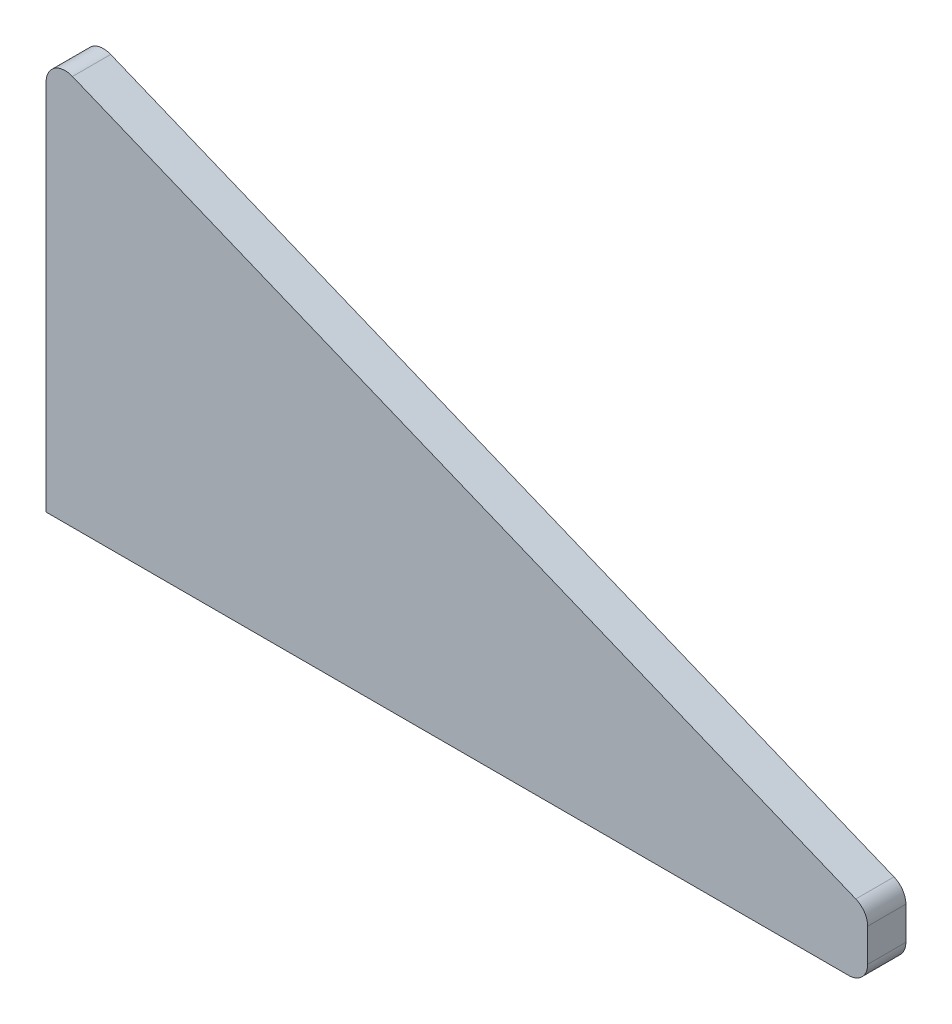
ISO-10303-21;
HEADER;
FILE_DESCRIPTION(('STEP AP214'),'2;1');
FILE_NAME('part.step','',(''),(''),'','','');
FILE_SCHEMA(('AUTOMOTIVE_DESIGN { 1 0 10303 214 1 1 1 1 }'));
ENDSEC;
DATA;
#1=APPLICATION_CONTEXT('core data for automotive mechanical design processes');
#2=APPLICATION_PROTOCOL_DEFINITION('international standard','automotive_design',2000,#1);
#3=PRODUCT_CONTEXT('',#1,'mechanical');
#4=PRODUCT('Part','Part','',(#3));
#5=PRODUCT_RELATED_PRODUCT_CATEGORY('part','',(#4));
#6=PRODUCT_DEFINITION_FORMATION('','',#4);
#7=PRODUCT_DEFINITION_CONTEXT('part definition',#1,'design');
#8=PRODUCT_DEFINITION('design','',#6,#7);
#9=PRODUCT_DEFINITION_SHAPE('','',#8);
#10=(LENGTH_UNIT() NAMED_UNIT(*) SI_UNIT(.MILLI.,.METRE.));
#11=(NAMED_UNIT(*) PLANE_ANGLE_UNIT() SI_UNIT($,.RADIAN.));
#12=(NAMED_UNIT(*) SI_UNIT($,.STERADIAN.) SOLID_ANGLE_UNIT());
#13=UNCERTAINTY_MEASURE_WITH_UNIT(LENGTH_MEASURE(1.E-05),#10,'distance_accuracy_value','');
#14=(GEOMETRIC_REPRESENTATION_CONTEXT(3) GLOBAL_UNCERTAINTY_ASSIGNED_CONTEXT((#13)) GLOBAL_UNIT_ASSIGNED_CONTEXT((#10,
#11,#12)) REPRESENTATION_CONTEXT('',''));
#15=CARTESIAN_POINT('',(0.,0.,0.));
#16=DIRECTION('',(0.,0.,1.));
#17=DIRECTION('',(1.,0.,0.));
#18=AXIS2_PLACEMENT_3D('',#15,#16,#17);
#19=CARTESIAN_POINT('',(-85.5050231709595,-49.7933467110658,10.));
#20=DIRECTION('',(0.,1.,0.));
#21=DIRECTION('',(0.,0.,1.));
#22=AXIS2_PLACEMENT_3D('',#19,#20,#21);
#23=PLANE('',#22);
#24=DIRECTION('',(1.,0.,0.));
#25=VECTOR('',#24,1.);
#26=CARTESIAN_POINT('',(-85.5050231709595,-49.7933467110658,0.));
#27=LINE('',#26,#25);
#28=CARTESIAN_POINT('',(-85.5050231709595,-49.7933467110658,0.));
#29=VERTEX_POINT('',#28);
#30=CARTESIAN_POINT('',(124.49497682904,-49.7933467110658,0.));
#31=VERTEX_POINT('',#30);
#32=EDGE_CURVE('E134',#29,#31,#27,.T.);
#33=ORIENTED_EDGE('',*,*,#32,.T.);
#34=DIRECTION('',(0.,0.,-1.));
#35=VECTOR('',#34,1.);
#36=CARTESIAN_POINT('',(124.49497682904,-49.7933467110658,10.));
#37=LINE('',#36,#35);
#38=CARTESIAN_POINT('',(124.49497682904,-49.7933467110658,10.));
#39=VERTEX_POINT('',#38);
#40=EDGE_CURVE('E11',#39,#31,#37,.T.);
#41=ORIENTED_EDGE('',*,*,#40,.F.);
#42=DIRECTION('',(1.,0.,0.));
#43=VECTOR('',#42,1.);
#44=CARTESIAN_POINT('',(-85.5050231709595,-49.7933467110658,10.));
#45=LINE('',#44,#43);
#46=CARTESIAN_POINT('',(-85.5050231709595,-49.7933467110658,10.));
#47=VERTEX_POINT('',#46);
#48=EDGE_CURVE('E153',#47,#39,#45,.T.);
#49=ORIENTED_EDGE('',*,*,#48,.F.);
#50=DIRECTION('',(0.,0.,-1.));
#51=VECTOR('',#50,1.);
#52=CARTESIAN_POINT('',(-85.5050231709595,-49.7933467110658,10.));
#53=LINE('',#52,#51);
#54=EDGE_CURVE('E130',#47,#29,#53,.T.);
#55=ORIENTED_EDGE('',*,*,#54,.T.);
#56=EDGE_LOOP('',(#33,#41,#49,#55));
#57=FACE_BOUND('',#56,.T.);
#58=ADVANCED_FACE('F39',(#57),#23,.F.);
#59=CARTESIAN_POINT('',(124.49497682904,-44.7933467110658,10.));
#60=DIRECTION('',(0.,0.,-1.));
#61=DIRECTION('',(-1.,0.,0.));
#62=AXIS2_PLACEMENT_3D('',#59,#60,#61);
#63=CYLINDRICAL_SURFACE('',#62,5.);
#64=CARTESIAN_POINT('',(124.49497682904,-44.7933467110658,0.));
#65=DIRECTION('',(0.,0.,1.));
#66=DIRECTION('',(-1.,0.,0.));
#67=AXIS2_PLACEMENT_3D('',#64,#65,#66);
#68=CIRCLE('',#67,5.);
#69=CARTESIAN_POINT('',(129.49497682904,-44.7933467110658,0.));
#70=VERTEX_POINT('',#69);
#71=EDGE_CURVE('E138',#31,#70,#68,.T.);
#72=ORIENTED_EDGE('',*,*,#71,.T.);
#73=DIRECTION('',(0.,0.,-1.));
#74=VECTOR('',#73,1.);
#75=CARTESIAN_POINT('',(129.49497682904,-44.7933467110658,10.));
#76=LINE('',#75,#74);
#77=CARTESIAN_POINT('',(129.49497682904,-44.7933467110658,10.));
#78=VERTEX_POINT('',#77);
#79=EDGE_CURVE('E48',#78,#70,#76,.T.);
#80=ORIENTED_EDGE('',*,*,#79,.F.);
#81=CARTESIAN_POINT('',(124.49497682904,-44.7933467110658,10.));
#82=DIRECTION('',(0.,0.,1.));
#83=DIRECTION('',(-1.,0.,0.));
#84=AXIS2_PLACEMENT_3D('',#81,#82,#83);
#85=CIRCLE('',#84,5.);
#86=EDGE_CURVE('E96',#39,#78,#85,.T.);
#87=ORIENTED_EDGE('',*,*,#86,.F.);
#88=ORIENTED_EDGE('',*,*,#40,.T.);
#89=EDGE_LOOP('',(#72,#80,#87,#88));
#90=FACE_BOUND('',#89,.T.);
#91=ADVANCED_FACE('F187',(#90),#63,.T.);
#92=CARTESIAN_POINT('',(129.49497682904,-36.149446474251,10.));
#93=DIRECTION('',(-1.,0.,0.));
#94=DIRECTION('',(0.,0.,1.));
#95=AXIS2_PLACEMENT_3D('',#92,#93,#94);
#96=PLANE('',#95);
#97=DIRECTION('',(0.,1.,0.));
#98=VECTOR('',#97,1.);
#99=CARTESIAN_POINT('',(129.49497682904,-36.149446474251,0.));
#100=LINE('',#99,#98);
#101=CARTESIAN_POINT('',(129.49497682904,-36.149446474251,0.));
#102=VERTEX_POINT('',#101);
#103=EDGE_CURVE('E141',#70,#102,#100,.T.);
#104=ORIENTED_EDGE('',*,*,#103,.T.);
#105=DIRECTION('',(0.,0.,-1.));
#106=VECTOR('',#105,1.);
#107=CARTESIAN_POINT('',(129.49497682904,-36.149446474251,10.));
#108=LINE('',#107,#106);
#109=CARTESIAN_POINT('',(129.49497682904,-36.149446474251,10.));
#110=VERTEX_POINT('',#109);
#111=EDGE_CURVE('E160',#110,#102,#108,.T.);
#112=ORIENTED_EDGE('',*,*,#111,.F.);
#113=DIRECTION('',(0.,1.,0.));
#114=VECTOR('',#113,1.);
#115=CARTESIAN_POINT('',(129.49497682904,-36.149446474251,10.));
#116=LINE('',#115,#114);
#117=EDGE_CURVE('E170',#78,#110,#116,.T.);
#118=ORIENTED_EDGE('',*,*,#117,.F.);
#119=ORIENTED_EDGE('',*,*,#79,.T.);
#120=EDGE_LOOP('',(#104,#112,#118,#119));
#121=FACE_BOUND('',#120,.T.);
#122=ADVANCED_FACE('F168',(#121),#96,.F.);
#123=CARTESIAN_POINT('',(124.49497682904,-36.1494464742509,10.));
#124=DIRECTION('',(0.,0.,-1.));
#125=DIRECTION('',(-1.,0.,0.));
#126=AXIS2_PLACEMENT_3D('',#123,#124,#125);
#127=CYLINDRICAL_SURFACE('',#126,5.);
#128=CARTESIAN_POINT('',(124.49497682904,-36.1494464742509,0.));
#129=DIRECTION('',(0.,0.,1.));
#130=DIRECTION('',(-1.,0.,0.));
#131=AXIS2_PLACEMENT_3D('',#128,#129,#130);
#132=CIRCLE('',#131,5.);
#133=CARTESIAN_POINT('',(126.388979080693,-31.5220546094168,0.));
#134=VERTEX_POINT('',#133);
#135=EDGE_CURVE('E144',#102,#134,#132,.T.);
#136=ORIENTED_EDGE('',*,*,#135,.T.);
#137=DIRECTION('',(0.,0.,-1.));
#138=VECTOR('',#137,1.);
#139=CARTESIAN_POINT('',(126.388979080693,-31.5220546094168,10.));
#140=LINE('',#139,#138);
#141=CARTESIAN_POINT('',(126.388979080693,-31.5220546094168,10.));
#142=VERTEX_POINT('',#141);
#143=EDGE_CURVE('E123',#142,#134,#140,.T.);
#144=ORIENTED_EDGE('',*,*,#143,.F.);
#145=CARTESIAN_POINT('',(124.49497682904,-36.1494464742509,10.));
#146=DIRECTION('',(0.,0.,1.));
#147=DIRECTION('',(-1.,0.,0.));
#148=AXIS2_PLACEMENT_3D('',#145,#146,#147);
#149=CIRCLE('',#148,5.);
#150=EDGE_CURVE('E112',#110,#142,#149,.T.);
#151=ORIENTED_EDGE('',*,*,#150,.F.);
#152=ORIENTED_EDGE('',*,*,#111,.T.);
#153=EDGE_LOOP('',(#136,#144,#151,#152));
#154=FACE_BOUND('',#153,.T.);
#155=ADVANCED_FACE('F176',(#154),#127,.T.);
#156=CARTESIAN_POINT('',(-78.6110209193065,52.3849221347692,10.));
#157=DIRECTION('',(-0.378800450330609,-0.925478372966828,0.));
#158=DIRECTION('',(0.925478372966828,-0.378800450330609,0.));
#159=AXIS2_PLACEMENT_3D('',#156,#157,#158);
#160=PLANE('',#159);
#161=DIRECTION('',(-0.925478372966828,0.378800450330609,0.));
#162=VECTOR('',#161,1.);
#163=CARTESIAN_POINT('',(-78.6110209193065,52.3849221347692,0.));
#164=LINE('',#163,#162);
#165=CARTESIAN_POINT('',(-78.6110209193065,52.3849221347692,0.));
#166=VERTEX_POINT('',#165);
#167=EDGE_CURVE('E121',#134,#166,#164,.T.);
#168=ORIENTED_EDGE('',*,*,#167,.T.);
#169=DIRECTION('',(0.,0.,-1.));
#170=VECTOR('',#169,1.);
#171=CARTESIAN_POINT('',(-78.6110209193065,52.3849221347692,10.));
#172=LINE('',#171,#170);
#173=CARTESIAN_POINT('',(-78.6110209193065,52.3849221347692,10.));
#174=VERTEX_POINT('',#173);
#175=EDGE_CURVE('E118',#174,#166,#172,.T.);
#176=ORIENTED_EDGE('',*,*,#175,.F.);
#177=DIRECTION('',(-0.925478372966828,0.378800450330609,0.));
#178=VECTOR('',#177,1.);
#179=CARTESIAN_POINT('',(-78.6110209193065,52.3849221347692,10.));
#180=LINE('',#179,#178);
#181=EDGE_CURVE('E106',#142,#174,#180,.T.);
#182=ORIENTED_EDGE('',*,*,#181,.F.);
#183=ORIENTED_EDGE('',*,*,#143,.T.);
#184=EDGE_LOOP('',(#168,#176,#182,#183));
#185=FACE_BOUND('',#184,.T.);
#186=ADVANCED_FACE('F119',(#185),#160,.F.);
#187=CARTESIAN_POINT('',(-80.5050231709595,47.7575302699351,10.));
#188=DIRECTION('',(0.,0.,-1.));
#189=DIRECTION('',(-1.,0.,0.));
#190=AXIS2_PLACEMENT_3D('',#187,#188,#189);
#191=CYLINDRICAL_SURFACE('',#190,5.);
#192=CARTESIAN_POINT('',(-80.5050231709595,47.7575302699351,0.));
#193=DIRECTION('',(0.,0.,1.));
#194=DIRECTION('',(-1.,0.,0.));
#195=AXIS2_PLACEMENT_3D('',#192,#193,#194);
#196=CIRCLE('',#195,5.);
#197=CARTESIAN_POINT('',(-85.5050231709595,47.757530269935,0.));
#198=VERTEX_POINT('',#197);
#199=EDGE_CURVE('E82',#166,#198,#196,.T.);
#200=ORIENTED_EDGE('',*,*,#199,.T.);
#201=DIRECTION('',(0.,0.,-1.));
#202=VECTOR('',#201,1.);
#203=CARTESIAN_POINT('',(-85.5050231709595,47.757530269935,10.));
#204=LINE('',#203,#202);
#205=CARTESIAN_POINT('',(-85.5050231709595,47.757530269935,10.));
#206=VERTEX_POINT('',#205);
#207=EDGE_CURVE('E124',#206,#198,#204,.T.);
#208=ORIENTED_EDGE('',*,*,#207,.F.);
#209=CARTESIAN_POINT('',(-80.5050231709595,47.7575302699351,10.));
#210=DIRECTION('',(0.,0.,1.));
#211=DIRECTION('',(-1.,0.,0.));
#212=AXIS2_PLACEMENT_3D('',#209,#210,#211);
#213=CIRCLE('',#212,5.);
#214=EDGE_CURVE('E110',#174,#206,#213,.T.);
#215=ORIENTED_EDGE('',*,*,#214,.F.);
#216=ORIENTED_EDGE('',*,*,#175,.T.);
#217=EDGE_LOOP('',(#200,#208,#215,#216));
#218=FACE_BOUND('',#217,.T.);
#219=ADVANCED_FACE('F126',(#218),#191,.T.);
#220=CARTESIAN_POINT('',(-85.5050231709595,47.757530269935,10.));
#221=DIRECTION('',(1.,0.,0.));
#222=DIRECTION('',(0.,0.,-1.));
#223=AXIS2_PLACEMENT_3D('',#220,#221,#222);
#224=PLANE('',#223);
#225=DIRECTION('',(0.,-1.,0.));
#226=VECTOR('',#225,1.);
#227=CARTESIAN_POINT('',(-85.5050231709595,47.757530269935,0.));
#228=LINE('',#227,#226);
#229=EDGE_CURVE('E88',#198,#29,#228,.T.);
#230=ORIENTED_EDGE('',*,*,#229,.T.);
#231=ORIENTED_EDGE('',*,*,#54,.F.);
#232=DIRECTION('',(0.,-1.,0.));
#233=VECTOR('',#232,1.);
#234=CARTESIAN_POINT('',(-85.5050231709595,47.757530269935,10.));
#235=LINE('',#234,#233);
#236=EDGE_CURVE('E56',#206,#47,#235,.T.);
#237=ORIENTED_EDGE('',*,*,#236,.F.);
#238=ORIENTED_EDGE('',*,*,#207,.T.);
#239=EDGE_LOOP('',(#230,#231,#237,#238));
#240=FACE_BOUND('',#239,.T.);
#241=ADVANCED_FACE('F201',(#240),#224,.F.);
#242=CARTESIAN_POINT('',(124.49497682904,-44.7933467110658,10.));
#243=DIRECTION('',(0.,0.,-1.));
#244=DIRECTION('',(-1.,0.,0.));
#245=AXIS2_PLACEMENT_3D('',#242,#243,#244);
#246=PLANE('',#245);
#247=ORIENTED_EDGE('',*,*,#48,.T.);
#248=ORIENTED_EDGE('',*,*,#86,.T.);
#249=ORIENTED_EDGE('',*,*,#117,.T.);
#250=ORIENTED_EDGE('',*,*,#150,.T.);
#251=ORIENTED_EDGE('',*,*,#181,.T.);
#252=ORIENTED_EDGE('',*,*,#214,.T.);
#253=ORIENTED_EDGE('',*,*,#236,.T.);
#254=EDGE_LOOP('',(#247,#248,#249,#250,#251,#252,#253));
#255=FACE_BOUND('',#254,.T.);
#256=ADVANCED_FACE('F108',(#255),#246,.F.);
#257=CARTESIAN_POINT('',(124.49497682904,-44.7933467110658,0.));
#258=DIRECTION('',(0.,0.,-1.));
#259=DIRECTION('',(-1.,0.,0.));
#260=AXIS2_PLACEMENT_3D('',#257,#258,#259);
#261=PLANE('',#260);
#262=ORIENTED_EDGE('',*,*,#32,.F.);
#263=ORIENTED_EDGE('',*,*,#229,.F.);
#264=ORIENTED_EDGE('',*,*,#199,.F.);
#265=ORIENTED_EDGE('',*,*,#167,.F.);
#266=ORIENTED_EDGE('',*,*,#135,.F.);
#267=ORIENTED_EDGE('',*,*,#103,.F.);
#268=ORIENTED_EDGE('',*,*,#71,.F.);
#269=EDGE_LOOP('',(#262,#263,#264,#265,#266,#267,#268));
#270=FACE_BOUND('',#269,.T.);
#271=ADVANCED_FACE('F174',(#270),#261,.T.);
#272=CLOSED_SHELL('',(#58,#91,#122,#155,#186,#219,#241,#256,#271));
#273=MANIFOLD_SOLID_BREP('B2',#272);
#274=ADVANCED_BREP_SHAPE_REPRESENTATION('',(#18,#273),#14);
#275=SHAPE_DEFINITION_REPRESENTATION(#9,#274);
ENDSEC;
END-ISO-10303-21;
